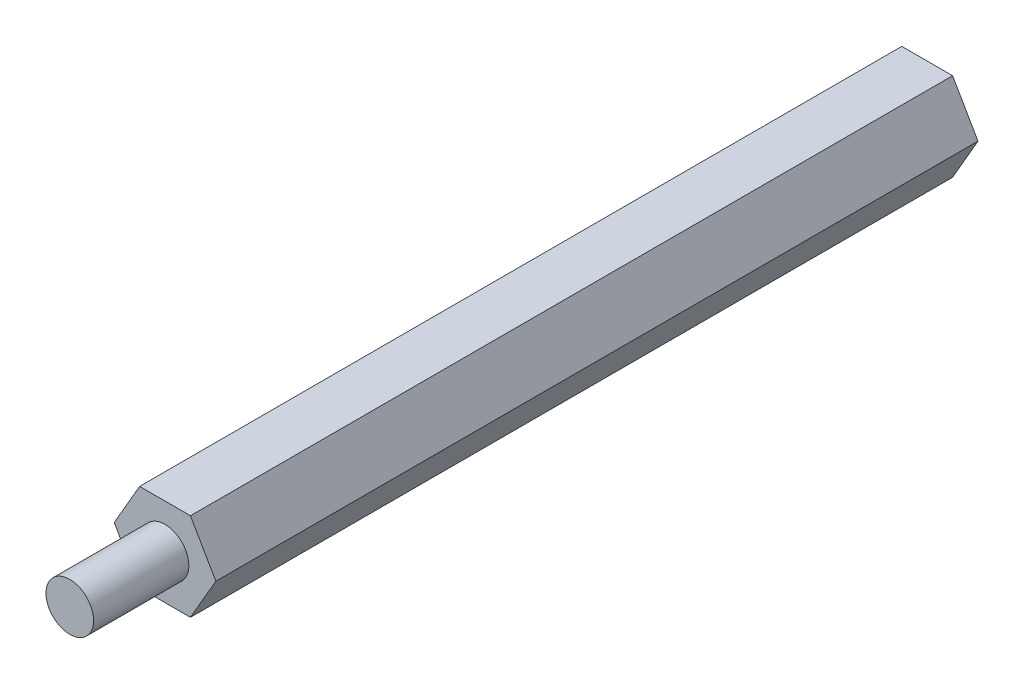
ISO-10303-21;
HEADER;
FILE_DESCRIPTION(('STEP AP214'),'2;1');
FILE_NAME('part.step','',(''),(''),'','','');
FILE_SCHEMA(('AUTOMOTIVE_DESIGN { 1 0 10303 214 1 1 1 1 }'));
ENDSEC;
DATA;
#1=APPLICATION_CONTEXT('core data for automotive mechanical design processes');
#2=APPLICATION_PROTOCOL_DEFINITION('international standard','automotive_design',2000,#1);
#3=PRODUCT_CONTEXT('',#1,'mechanical');
#4=PRODUCT('Part','Part','',(#3));
#5=PRODUCT_RELATED_PRODUCT_CATEGORY('part','',(#4));
#6=PRODUCT_DEFINITION_FORMATION('','',#4);
#7=PRODUCT_DEFINITION_CONTEXT('part definition',#1,'design');
#8=PRODUCT_DEFINITION('design','',#6,#7);
#9=PRODUCT_DEFINITION_SHAPE('','',#8);
#10=(LENGTH_UNIT() NAMED_UNIT(*) SI_UNIT(.MILLI.,.METRE.));
#11=(NAMED_UNIT(*) PLANE_ANGLE_UNIT() SI_UNIT($,.RADIAN.));
#12=(NAMED_UNIT(*) SI_UNIT($,.STERADIAN.) SOLID_ANGLE_UNIT());
#13=UNCERTAINTY_MEASURE_WITH_UNIT(LENGTH_MEASURE(1.E-05),#10,'distance_accuracy_value','');
#14=(GEOMETRIC_REPRESENTATION_CONTEXT(3) GLOBAL_UNCERTAINTY_ASSIGNED_CONTEXT((#13)) GLOBAL_UNIT_ASSIGNED_CONTEXT((#10,
#11,#12)) REPRESENTATION_CONTEXT('',''));
#15=CARTESIAN_POINT('',(0.,0.,0.));
#16=DIRECTION('',(0.,0.,1.));
#17=DIRECTION('',(1.,0.,0.));
#18=AXIS2_PLACEMENT_3D('',#15,#16,#17);
#19=CARTESIAN_POINT('',(3.2,0.,48.));
#20=DIRECTION('',(-0.866025403784439,-0.5,0.));
#21=DIRECTION('',(0.5,-0.866025403784439,0.));
#22=AXIS2_PLACEMENT_3D('',#19,#20,#21);
#23=PLANE('',#22);
#24=DIRECTION('',(-0.5,0.866025403784439,0.));
#25=VECTOR('',#24,1.);
#26=CARTESIAN_POINT('',(3.2,0.,0.));
#27=LINE('',#26,#25);
#28=CARTESIAN_POINT('',(3.2,0.,0.));
#29=VERTEX_POINT('',#28);
#30=CARTESIAN_POINT('',(1.6,2.7712812921102,0.));
#31=VERTEX_POINT('',#30);
#32=EDGE_CURVE('E130',#29,#31,#27,.T.);
#33=ORIENTED_EDGE('',*,*,#32,.T.);
#34=DIRECTION('',(0.,0.,-1.));
#35=VECTOR('',#34,1.);
#36=CARTESIAN_POINT('',(1.6,2.7712812921102,48.));
#37=LINE('',#36,#35);
#38=CARTESIAN_POINT('',(1.6,2.7712812921102,48.));
#39=VERTEX_POINT('',#38);
#40=EDGE_CURVE('E42',#39,#31,#37,.T.);
#41=ORIENTED_EDGE('',*,*,#40,.F.);
#42=DIRECTION('',(-0.5,0.866025403784439,0.));
#43=VECTOR('',#42,1.);
#44=CARTESIAN_POINT('',(3.2,0.,48.));
#45=LINE('',#44,#43);
#46=CARTESIAN_POINT('',(3.2,0.,48.));
#47=VERTEX_POINT('',#46);
#48=EDGE_CURVE('E147',#47,#39,#45,.T.);
#49=ORIENTED_EDGE('',*,*,#48,.F.);
#50=DIRECTION('',(0.,0.,-1.));
#51=VECTOR('',#50,1.);
#52=CARTESIAN_POINT('',(3.2,0.,48.));
#53=LINE('',#52,#51);
#54=EDGE_CURVE('E126',#47,#29,#53,.T.);
#55=ORIENTED_EDGE('',*,*,#54,.T.);
#56=EDGE_LOOP('',(#33,#41,#49,#55));
#57=FACE_BOUND('',#56,.T.);
#58=ADVANCED_FACE('F39',(#57),#23,.F.);
#59=CARTESIAN_POINT('',(1.6,2.7712812921102,48.));
#60=DIRECTION('',(0.,-1.,0.));
#61=DIRECTION('',(1.,0.,0.));
#62=AXIS2_PLACEMENT_3D('',#59,#60,#61);
#63=PLANE('',#62);
#64=DIRECTION('',(-1.,0.,0.));
#65=VECTOR('',#64,1.);
#66=CARTESIAN_POINT('',(1.6,2.7712812921102,0.));
#67=LINE('',#66,#65);
#68=CARTESIAN_POINT('',(-1.6,2.77128129211021,0.));
#69=VERTEX_POINT('',#68);
#70=EDGE_CURVE('E134',#31,#69,#67,.T.);
#71=ORIENTED_EDGE('',*,*,#70,.T.);
#72=DIRECTION('',(0.,0.,-1.));
#73=VECTOR('',#72,1.);
#74=CARTESIAN_POINT('',(-1.6,2.77128129211021,48.));
#75=LINE('',#74,#73);
#76=CARTESIAN_POINT('',(-1.6,2.77128129211021,48.));
#77=VERTEX_POINT('',#76);
#78=EDGE_CURVE('E153',#77,#69,#75,.T.);
#79=ORIENTED_EDGE('',*,*,#78,.F.);
#80=DIRECTION('',(-1.,0.,0.));
#81=VECTOR('',#80,1.);
#82=CARTESIAN_POINT('',(1.6,2.7712812921102,48.));
#83=LINE('',#82,#81);
#84=EDGE_CURVE('E95',#39,#77,#83,.T.);
#85=ORIENTED_EDGE('',*,*,#84,.F.);
#86=ORIENTED_EDGE('',*,*,#40,.T.);
#87=EDGE_LOOP('',(#71,#79,#85,#86));
#88=FACE_BOUND('',#87,.T.);
#89=ADVANCED_FACE('F160',(#88),#63,.F.);
#90=CARTESIAN_POINT('',(-1.6,2.77128129211021,48.));
#91=DIRECTION('',(0.866025403784439,-0.5,0.));
#92=DIRECTION('',(0.5,0.866025403784439,0.));
#93=AXIS2_PLACEMENT_3D('',#90,#91,#92);
#94=PLANE('',#93);
#95=DIRECTION('',(-0.5,-0.866025403784439,0.));
#96=VECTOR('',#95,1.);
#97=CARTESIAN_POINT('',(-1.6,2.77128129211021,0.));
#98=LINE('',#97,#96);
#99=CARTESIAN_POINT('',(-3.2,0.,0.));
#100=VERTEX_POINT('',#99);
#101=EDGE_CURVE('E138',#69,#100,#98,.T.);
#102=ORIENTED_EDGE('',*,*,#101,.T.);
#103=DIRECTION('',(0.,0.,-1.));
#104=VECTOR('',#103,1.);
#105=CARTESIAN_POINT('',(-3.2,0.,48.));
#106=LINE('',#105,#104);
#107=CARTESIAN_POINT('',(-3.2,0.,48.));
#108=VERTEX_POINT('',#107);
#109=EDGE_CURVE('E119',#108,#100,#106,.T.);
#110=ORIENTED_EDGE('',*,*,#109,.F.);
#111=DIRECTION('',(-0.5,-0.866025403784439,0.));
#112=VECTOR('',#111,1.);
#113=CARTESIAN_POINT('',(-1.6,2.77128129211021,48.));
#114=LINE('',#113,#112);
#115=EDGE_CURVE('E108',#77,#108,#114,.T.);
#116=ORIENTED_EDGE('',*,*,#115,.F.);
#117=ORIENTED_EDGE('',*,*,#78,.T.);
#118=EDGE_LOOP('',(#102,#110,#116,#117));
#119=FACE_BOUND('',#118,.T.);
#120=ADVANCED_FACE('F166',(#119),#94,.F.);
#121=CARTESIAN_POINT('',(-3.2,0.,48.));
#122=DIRECTION('',(0.866025403784439,0.5,0.));
#123=DIRECTION('',(-0.5,0.866025403784439,0.));
#124=AXIS2_PLACEMENT_3D('',#121,#122,#123);
#125=PLANE('',#124);
#126=DIRECTION('',(0.5,-0.866025403784439,0.));
#127=VECTOR('',#126,1.);
#128=CARTESIAN_POINT('',(-3.2,0.,0.));
#129=LINE('',#128,#127);
#130=CARTESIAN_POINT('',(-1.6,-2.7712812921102,0.));
#131=VERTEX_POINT('',#130);
#132=EDGE_CURVE('E117',#100,#131,#129,.T.);
#133=ORIENTED_EDGE('',*,*,#132,.T.);
#134=DIRECTION('',(0.,0.,-1.));
#135=VECTOR('',#134,1.);
#136=CARTESIAN_POINT('',(-1.6,-2.7712812921102,48.));
#137=LINE('',#136,#135);
#138=CARTESIAN_POINT('',(-1.6,-2.7712812921102,48.));
#139=VERTEX_POINT('',#138);
#140=EDGE_CURVE('E114',#139,#131,#137,.T.);
#141=ORIENTED_EDGE('',*,*,#140,.F.);
#142=DIRECTION('',(0.5,-0.866025403784439,0.));
#143=VECTOR('',#142,1.);
#144=CARTESIAN_POINT('',(-3.2,0.,48.));
#145=LINE('',#144,#143);
#146=EDGE_CURVE('E102',#108,#139,#145,.T.);
#147=ORIENTED_EDGE('',*,*,#146,.F.);
#148=ORIENTED_EDGE('',*,*,#109,.T.);
#149=EDGE_LOOP('',(#133,#141,#147,#148));
#150=FACE_BOUND('',#149,.T.);
#151=ADVANCED_FACE('F115',(#150),#125,.F.);
#152=CARTESIAN_POINT('',(-1.6,-2.7712812921102,48.));
#153=DIRECTION('',(0.,1.,0.));
#154=DIRECTION('',(-1.,0.,0.));
#155=AXIS2_PLACEMENT_3D('',#152,#153,#154);
#156=PLANE('',#155);
#157=DIRECTION('',(1.,0.,0.));
#158=VECTOR('',#157,1.);
#159=CARTESIAN_POINT('',(-1.6,-2.7712812921102,0.));
#160=LINE('',#159,#158);
#161=CARTESIAN_POINT('',(1.6,-2.7712812921102,0.));
#162=VERTEX_POINT('',#161);
#163=EDGE_CURVE('E80',#131,#162,#160,.T.);
#164=ORIENTED_EDGE('',*,*,#163,.T.);
#165=DIRECTION('',(0.,0.,-1.));
#166=VECTOR('',#165,1.);
#167=CARTESIAN_POINT('',(1.6,-2.7712812921102,48.));
#168=LINE('',#167,#166);
#169=CARTESIAN_POINT('',(1.6,-2.7712812921102,48.));
#170=VERTEX_POINT('',#169);
#171=EDGE_CURVE('E120',#170,#162,#168,.T.);
#172=ORIENTED_EDGE('',*,*,#171,.F.);
#173=DIRECTION('',(1.,0.,0.));
#174=VECTOR('',#173,1.);
#175=CARTESIAN_POINT('',(-1.6,-2.7712812921102,48.));
#176=LINE('',#175,#174);
#177=EDGE_CURVE('E106',#139,#170,#176,.T.);
#178=ORIENTED_EDGE('',*,*,#177,.F.);
#179=ORIENTED_EDGE('',*,*,#140,.T.);
#180=EDGE_LOOP('',(#164,#172,#178,#179));
#181=FACE_BOUND('',#180,.T.);
#182=ADVANCED_FACE('F122',(#181),#156,.F.);
#183=CARTESIAN_POINT('',(1.6,-2.7712812921102,48.));
#184=DIRECTION('',(-0.866025403784439,0.5,0.));
#185=DIRECTION('',(-0.5,-0.866025403784439,0.));
#186=AXIS2_PLACEMENT_3D('',#183,#184,#185);
#187=PLANE('',#186);
#188=DIRECTION('',(0.5,0.866025403784439,0.));
#189=VECTOR('',#188,1.);
#190=CARTESIAN_POINT('',(1.6,-2.7712812921102,0.));
#191=LINE('',#190,#189);
#192=EDGE_CURVE('E86',#162,#29,#191,.T.);
#193=ORIENTED_EDGE('',*,*,#192,.T.);
#194=ORIENTED_EDGE('',*,*,#54,.F.);
#195=DIRECTION('',(0.5,0.866025403784439,0.));
#196=VECTOR('',#195,1.);
#197=CARTESIAN_POINT('',(1.6,-2.7712812921102,48.));
#198=LINE('',#197,#196);
#199=EDGE_CURVE('E57',#170,#47,#198,.T.);
#200=ORIENTED_EDGE('',*,*,#199,.F.);
#201=ORIENTED_EDGE('',*,*,#171,.T.);
#202=EDGE_LOOP('',(#193,#194,#200,#201));
#203=FACE_BOUND('',#202,.T.);
#204=ADVANCED_FACE('F195',(#203),#187,.F.);
#205=CARTESIAN_POINT('',(0.,0.,48.));
#206=DIRECTION('',(0.,0.,1.));
#207=DIRECTION('',(1.,0.,0.));
#208=AXIS2_PLACEMENT_3D('',#205,#206,#207);
#209=PLANE('',#208);
#210=CARTESIAN_POINT('',(0.,0.,48.));
#211=DIRECTION('',(0.,0.,1.));
#212=DIRECTION('',(1.,0.,0.));
#213=AXIS2_PLACEMENT_3D('',#210,#211,#212);
#214=CIRCLE('',#213,1.5);
#215=CARTESIAN_POINT('',(1.5,0.,48.));
#216=VERTEX_POINT('',#215);
#217=EDGE_CURVE('E11',#216,#216,#214,.T.);
#218=ORIENTED_EDGE('',*,*,#217,.F.);
#219=EDGE_LOOP('',(#218));
#220=FACE_BOUND('',#219,.T.);
#221=ORIENTED_EDGE('',*,*,#48,.T.);
#222=ORIENTED_EDGE('',*,*,#84,.T.);
#223=ORIENTED_EDGE('',*,*,#115,.T.);
#224=ORIENTED_EDGE('',*,*,#146,.T.);
#225=ORIENTED_EDGE('',*,*,#177,.T.);
#226=ORIENTED_EDGE('',*,*,#199,.T.);
#227=EDGE_LOOP('',(#221,#222,#223,#224,#225,#226));
#228=FACE_BOUND('',#227,.T.);
#229=ADVANCED_FACE('F104',(#220,#228),#209,.T.);
#230=CARTESIAN_POINT('',(0.,0.,0.));
#231=DIRECTION('',(0.,0.,1.));
#232=DIRECTION('',(1.,0.,0.));
#233=AXIS2_PLACEMENT_3D('',#230,#231,#232);
#234=PLANE('',#233);
#235=CARTESIAN_POINT('',(0.,0.,0.));
#236=DIRECTION('',(0.,0.,-1.));
#237=DIRECTION('',(-1.,0.,0.));
#238=AXIS2_PLACEMENT_3D('',#235,#236,#237);
#239=CIRCLE('',#238,1.5);
#240=CARTESIAN_POINT('',(-1.5,0.,0.));
#241=VERTEX_POINT('',#240);
#242=EDGE_CURVE('E173',#241,#241,#239,.T.);
#243=ORIENTED_EDGE('',*,*,#242,.F.);
#244=EDGE_LOOP('',(#243));
#245=FACE_BOUND('',#244,.T.);
#246=ORIENTED_EDGE('',*,*,#32,.F.);
#247=ORIENTED_EDGE('',*,*,#192,.F.);
#248=ORIENTED_EDGE('',*,*,#163,.F.);
#249=ORIENTED_EDGE('',*,*,#132,.F.);
#250=ORIENTED_EDGE('',*,*,#101,.F.);
#251=ORIENTED_EDGE('',*,*,#70,.F.);
#252=EDGE_LOOP('',(#246,#247,#248,#249,#250,#251));
#253=FACE_BOUND('',#252,.T.);
#254=ADVANCED_FACE('F165',(#245,#253),#234,.F.);
#255=CARTESIAN_POINT('',(0.,0.,6.));
#256=DIRECTION('',(0.,0.,-1.));
#257=DIRECTION('',(-1.,0.,0.));
#258=AXIS2_PLACEMENT_3D('',#255,#256,#257);
#259=CYLINDRICAL_SURFACE('',#258,1.5);
#260=CARTESIAN_POINT('',(0.,0.,6.));
#261=DIRECTION('',(0.,0.,-1.));
#262=DIRECTION('',(-1.,0.,0.));
#263=AXIS2_PLACEMENT_3D('',#260,#261,#262);
#264=CIRCLE('',#263,1.5);
#265=CARTESIAN_POINT('',(-1.5,0.,6.));
#266=VERTEX_POINT('',#265);
#267=EDGE_CURVE('E135',#266,#266,#264,.T.);
#268=ORIENTED_EDGE('',*,*,#267,.F.);
#269=EDGE_LOOP('',(#268));
#270=FACE_BOUND('',#269,.T.);
#271=ORIENTED_EDGE('',*,*,#242,.T.);
#272=EDGE_LOOP('',(#271));
#273=FACE_BOUND('',#272,.T.);
#274=ADVANCED_FACE('F201',(#270,#273),#259,.F.);
#275=CARTESIAN_POINT('',(0.,0.,6.));
#276=DIRECTION('',(0.,0.,-1.));
#277=DIRECTION('',(-1.,0.,0.));
#278=AXIS2_PLACEMENT_3D('',#275,#276,#277);
#279=PLANE('',#278);
#280=ORIENTED_EDGE('',*,*,#267,.T.);
#281=EDGE_LOOP('',(#280));
#282=FACE_BOUND('',#281,.T.);
#283=ADVANCED_FACE('F190',(#282),#279,.T.);
#284=CARTESIAN_POINT('',(0.,0.,54.));
#285=DIRECTION('',(0.,0.,-1.));
#286=DIRECTION('',(-1.,0.,0.));
#287=AXIS2_PLACEMENT_3D('',#284,#285,#286);
#288=CYLINDRICAL_SURFACE('',#287,1.5);
#289=CARTESIAN_POINT('',(0.,0.,54.));
#290=DIRECTION('',(0.,0.,1.));
#291=DIRECTION('',(1.,0.,0.));
#292=AXIS2_PLACEMENT_3D('',#289,#290,#291);
#293=CIRCLE('',#292,1.5);
#294=CARTESIAN_POINT('',(1.5,0.,54.));
#295=VERTEX_POINT('',#294);
#296=EDGE_CURVE('E177',#295,#295,#293,.T.);
#297=ORIENTED_EDGE('',*,*,#296,.F.);
#298=EDGE_LOOP('',(#297));
#299=FACE_BOUND('',#298,.T.);
#300=ORIENTED_EDGE('',*,*,#217,.T.);
#301=EDGE_LOOP('',(#300));
#302=FACE_BOUND('',#301,.T.);
#303=ADVANCED_FACE('F187',(#299,#302),#288,.T.);
#304=CARTESIAN_POINT('',(0.,0.,54.));
#305=DIRECTION('',(0.,0.,1.));
#306=DIRECTION('',(1.,0.,0.));
#307=AXIS2_PLACEMENT_3D('',#304,#305,#306);
#308=PLANE('',#307);
#309=ORIENTED_EDGE('',*,*,#296,.T.);
#310=EDGE_LOOP('',(#309));
#311=FACE_BOUND('',#310,.T.);
#312=ADVANCED_FACE('F185',(#311),#308,.T.);
#313=CLOSED_SHELL('',(#58,#89,#120,#151,#182,#204,#229,#254,#274,#283,#303,#312));
#314=MANIFOLD_SOLID_BREP('B2',#313);
#315=ADVANCED_BREP_SHAPE_REPRESENTATION('',(#18,#314),#14);
#316=SHAPE_DEFINITION_REPRESENTATION(#9,#315);
ENDSEC;
END-ISO-10303-21;
